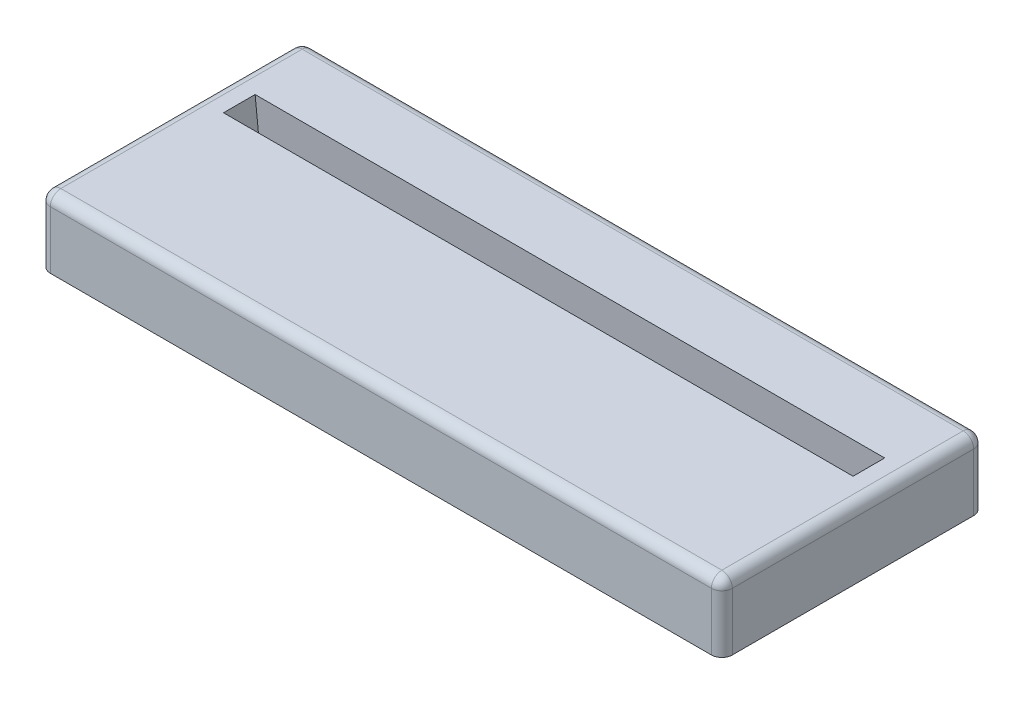
ISO-10303-21;
HEADER;
FILE_DESCRIPTION(('STEP AP214'),'2;1');
FILE_NAME('part.step','',(''),(''),'','','');
FILE_SCHEMA(('AUTOMOTIVE_DESIGN { 1 0 10303 214 1 1 1 1 }'));
ENDSEC;
DATA;
#1=APPLICATION_CONTEXT('core data for automotive mechanical design processes');
#2=APPLICATION_PROTOCOL_DEFINITION('international standard','automotive_design',2000,#1);
#3=PRODUCT_CONTEXT('',#1,'mechanical');
#4=PRODUCT('Part','Part','',(#3));
#5=PRODUCT_RELATED_PRODUCT_CATEGORY('part','',(#4));
#6=PRODUCT_DEFINITION_FORMATION('','',#4);
#7=PRODUCT_DEFINITION_CONTEXT('part definition',#1,'design');
#8=PRODUCT_DEFINITION('design','',#6,#7);
#9=PRODUCT_DEFINITION_SHAPE('','',#8);
#10=(LENGTH_UNIT() NAMED_UNIT(*) SI_UNIT(.MILLI.,.METRE.));
#11=(NAMED_UNIT(*) PLANE_ANGLE_UNIT() SI_UNIT($,.RADIAN.));
#12=(NAMED_UNIT(*) SI_UNIT($,.STERADIAN.) SOLID_ANGLE_UNIT());
#13=UNCERTAINTY_MEASURE_WITH_UNIT(LENGTH_MEASURE(1.E-05),#10,'distance_accuracy_value','');
#14=(GEOMETRIC_REPRESENTATION_CONTEXT(3) GLOBAL_UNCERTAINTY_ASSIGNED_CONTEXT((#13)) GLOBAL_UNIT_ASSIGNED_CONTEXT((#10,
#11,#12)) REPRESENTATION_CONTEXT('',''));
#15=CARTESIAN_POINT('',(0.,0.,0.));
#16=DIRECTION('',(0.,0.,1.));
#17=DIRECTION('',(1.,0.,0.));
#18=AXIS2_PLACEMENT_3D('',#15,#16,#17);
#19=CARTESIAN_POINT('',(120.,-6.5,0.));
#20=DIRECTION('',(0.,1.,0.));
#21=DIRECTION('',(0.,0.,1.));
#22=AXIS2_PLACEMENT_3D('',#19,#20,#21);
#23=PLANE('',#22);
#24=DIRECTION('',(-1.,0.,0.));
#25=VECTOR('',#24,1.);
#26=CARTESIAN_POINT('',(120.,-6.5,-10.5));
#27=LINE('',#26,#25);
#28=CARTESIAN_POINT('',(120.,-6.5,-10.5));
#29=VERTEX_POINT('',#28);
#30=CARTESIAN_POINT('',(0.,-6.5,-10.5));
#31=VERTEX_POINT('',#30);
#32=EDGE_CURVE('E348',#29,#31,#27,.T.);
#33=ORIENTED_EDGE('',*,*,#32,.T.);
#34=DIRECTION('',(0.,0.,-1.));
#35=VECTOR('',#34,1.);
#36=CARTESIAN_POINT('',(0.,-6.5,0.));
#37=LINE('',#36,#35);
#38=CARTESIAN_POINT('',(0.,-6.5,-7.50000000000001));
#39=VERTEX_POINT('',#38);
#40=EDGE_CURVE('E325',#39,#31,#37,.T.);
#41=ORIENTED_EDGE('',*,*,#40,.F.);
#42=DIRECTION('',(-1.,0.,0.));
#43=VECTOR('',#42,1.);
#44=CARTESIAN_POINT('',(120.,-6.5,-7.50000000000001));
#45=LINE('',#44,#43);
#46=CARTESIAN_POINT('',(120.,-6.5,-7.50000000000001));
#47=VERTEX_POINT('',#46);
#48=EDGE_CURVE('E314',#47,#39,#45,.T.);
#49=ORIENTED_EDGE('',*,*,#48,.F.);
#50=DIRECTION('',(0.,0.,-1.));
#51=VECTOR('',#50,1.);
#52=CARTESIAN_POINT('',(120.,-6.5,25.));
#53=LINE('',#52,#51);
#54=EDGE_CURVE('E290',#47,#29,#53,.T.);
#55=ORIENTED_EDGE('',*,*,#54,.T.);
#56=EDGE_LOOP('',(#33,#41,#49,#55));
#57=FACE_BOUND('',#56,.T.);
#58=DIRECTION('',(0.,0.,-1.));
#59=VECTOR('',#58,1.);
#60=CARTESIAN_POINT('',(-1.9,-6.5,21.9));
#61=LINE('',#60,#59);
#62=CARTESIAN_POINT('',(-1.9,-6.5,21.9));
#63=VERTEX_POINT('',#62);
#64=CARTESIAN_POINT('',(-1.9,-6.5,-21.9));
#65=VERTEX_POINT('',#64);
#66=EDGE_CURVE('E244',#63,#65,#61,.T.);
#67=ORIENTED_EDGE('',*,*,#66,.T.);
#68=DIRECTION('',(1.,0.,0.));
#69=VECTOR('',#68,1.);
#70=CARTESIAN_POINT('',(-1.9,-6.5,-21.9));
#71=LINE('',#70,#69);
#72=CARTESIAN_POINT('',(121.9,-6.5,-21.9));
#73=VERTEX_POINT('',#72);
#74=EDGE_CURVE('E215',#65,#73,#71,.T.);
#75=ORIENTED_EDGE('',*,*,#74,.T.);
#76=DIRECTION('',(0.,0.,1.));
#77=VECTOR('',#76,1.);
#78=CARTESIAN_POINT('',(121.9,-6.5,21.9));
#79=LINE('',#78,#77);
#80=CARTESIAN_POINT('',(121.9,-6.5,21.9));
#81=VERTEX_POINT('',#80);
#82=EDGE_CURVE('E239',#73,#81,#79,.T.);
#83=ORIENTED_EDGE('',*,*,#82,.T.);
#84=DIRECTION('',(-1.,0.,0.));
#85=VECTOR('',#84,1.);
#86=CARTESIAN_POINT('',(-1.9,-6.5,21.9));
#87=LINE('',#86,#85);
#88=EDGE_CURVE('E236',#81,#63,#87,.T.);
#89=ORIENTED_EDGE('',*,*,#88,.T.);
#90=EDGE_LOOP('',(#67,#75,#83,#89));
#91=FACE_BOUND('',#90,.T.);
#92=ADVANCED_FACE('F35',(#57,#91),#23,.F.);
#93=CARTESIAN_POINT('',(120.,6.5,0.));
#94=DIRECTION('',(0.,1.,0.));
#95=DIRECTION('',(0.,0.,1.));
#96=AXIS2_PLACEMENT_3D('',#93,#94,#95);
#97=PLANE('',#96);
#98=DIRECTION('',(-1.,0.,0.));
#99=VECTOR('',#98,1.);
#100=CARTESIAN_POINT('',(120.,6.5,-23.));
#101=LINE('',#100,#99);
#102=CARTESIAN_POINT('',(123.,6.5,-23.));
#103=VERTEX_POINT('',#102);
#104=CARTESIAN_POINT('',(-3.,6.5,-23.));
#105=VERTEX_POINT('',#104);
#106=EDGE_CURVE('E371',#103,#105,#101,.T.);
#107=ORIENTED_EDGE('',*,*,#106,.T.);
#108=DIRECTION('',(0.,0.,-1.));
#109=VECTOR('',#108,1.);
#110=CARTESIAN_POINT('',(-3.,6.5,25.));
#111=LINE('',#110,#109);
#112=CARTESIAN_POINT('',(-3.,6.5,23.));
#113=VERTEX_POINT('',#112);
#114=EDGE_CURVE('E373',#105,#113,#111,.F.);
#115=ORIENTED_EDGE('',*,*,#114,.T.);
#116=DIRECTION('',(1.,0.,0.));
#117=VECTOR('',#116,1.);
#118=CARTESIAN_POINT('',(120.,6.5,23.));
#119=LINE('',#118,#117);
#120=CARTESIAN_POINT('',(123.,6.5,23.));
#121=VERTEX_POINT('',#120);
#122=EDGE_CURVE('E367',#113,#121,#119,.T.);
#123=ORIENTED_EDGE('',*,*,#122,.T.);
#124=DIRECTION('',(0.,0.,1.));
#125=VECTOR('',#124,1.);
#126=CARTESIAN_POINT('',(123.,6.5,-25.));
#127=LINE('',#126,#125);
#128=EDGE_CURVE('E369',#121,#103,#127,.F.);
#129=ORIENTED_EDGE('',*,*,#128,.T.);
#130=EDGE_LOOP('',(#107,#115,#123,#129));
#131=FACE_BOUND('',#130,.T.);
#132=DIRECTION('',(-1.,0.,0.));
#133=VECTOR('',#132,1.);
#134=CARTESIAN_POINT('',(120.,6.5,-11.0356647853344));
#135=LINE('',#134,#133);
#136=CARTESIAN_POINT('',(120.,6.5,-11.0356647853344));
#137=VERTEX_POINT('',#136);
#138=CARTESIAN_POINT('',(0.,6.5,-11.0356647853344));
#139=VERTEX_POINT('',#138);
#140=EDGE_CURVE('E357',#137,#139,#135,.T.);
#141=ORIENTED_EDGE('',*,*,#140,.F.);
#142=DIRECTION('',(0.,0.,1.));
#143=VECTOR('',#142,1.);
#144=CARTESIAN_POINT('',(120.,6.5,25.));
#145=LINE('',#144,#143);
#146=CARTESIAN_POINT('',(120.,6.5,-5.00860993816238));
#147=VERTEX_POINT('',#146);
#148=EDGE_CURVE('E279',#137,#147,#145,.T.);
#149=ORIENTED_EDGE('',*,*,#148,.T.);
#150=DIRECTION('',(-1.,0.,0.));
#151=VECTOR('',#150,1.);
#152=CARTESIAN_POINT('',(120.,6.5,-5.00860993816238));
#153=LINE('',#152,#151);
#154=CARTESIAN_POINT('',(0.,6.5,-5.00860993816238));
#155=VERTEX_POINT('',#154);
#156=EDGE_CURVE('E316',#147,#155,#153,.T.);
#157=ORIENTED_EDGE('',*,*,#156,.T.);
#158=DIRECTION('',(0.,0.,-1.));
#159=VECTOR('',#158,1.);
#160=CARTESIAN_POINT('',(0.,6.5,0.));
#161=LINE('',#160,#159);
#162=EDGE_CURVE('E320',#155,#139,#161,.T.);
#163=ORIENTED_EDGE('',*,*,#162,.T.);
#164=EDGE_LOOP('',(#141,#149,#157,#163));
#165=FACE_BOUND('',#164,.T.);
#166=ADVANCED_FACE('F476',(#131,#165),#97,.T.);
#167=CARTESIAN_POINT('',(120.,1.09800518428661,-11.5492412352769));
#168=DIRECTION('',(0.,0.0946448625000819,-0.995511099889067));
#169=DIRECTION('',(0.,0.995511099889067,0.0946448625000819));
#170=AXIS2_PLACEMENT_3D('',#167,#168,#169);
#171=PLANE('',#170);
#172=DIRECTION('',(0.,-0.995511099889067,-0.0946448625000819));
#173=VECTOR('',#172,1.);
#174=CARTESIAN_POINT('',(0.,1.09800518428661,-11.5492412352769));
#175=LINE('',#174,#173);
#176=CARTESIAN_POINT('',(0.,-3.35995315796779,-11.9730665993344));
#177=VERTEX_POINT('',#176);
#178=EDGE_CURVE('E329',#139,#177,#175,.T.);
#179=ORIENTED_EDGE('',*,*,#178,.T.);
#180=DIRECTION('',(-1.,0.,0.));
#181=VECTOR('',#180,1.);
#182=CARTESIAN_POINT('',(120.,-3.35995315796779,-11.9730665993344));
#183=LINE('',#182,#181);
#184=CARTESIAN_POINT('',(120.,-3.35995315796779,-11.9730665993344));
#185=VERTEX_POINT('',#184);
#186=EDGE_CURVE('E354',#185,#177,#183,.T.);
#187=ORIENTED_EDGE('',*,*,#186,.F.);
#188=DIRECTION('',(0.,-0.995511099889067,-0.0946448625000819));
#189=VECTOR('',#188,1.);
#190=CARTESIAN_POINT('',(120.,1.09800518428661,-11.5492412352769));
#191=LINE('',#190,#189);
#192=EDGE_CURVE('E330',#137,#185,#191,.T.);
#193=ORIENTED_EDGE('',*,*,#192,.F.);
#194=ORIENTED_EDGE('',*,*,#140,.T.);
#195=EDGE_LOOP('',(#179,#187,#193,#194));
#196=FACE_BOUND('',#195,.T.);
#197=ADVANCED_FACE('F510',(#196),#171,.F.);
#198=CARTESIAN_POINT('',(120.,-4.4579583422544,-0.423825364057494));
#199=DIRECTION('',(0.,0.995511099889067,0.0946448625000818));
#200=DIRECTION('',(0.,-0.0946448625000818,0.995511099889067));
#201=AXIS2_PLACEMENT_3D('',#198,#199,#200);
#202=PLANE('',#201);
#203=DIRECTION('',(0.,0.0946448625000818,-0.995511099889067));
#204=VECTOR('',#203,1.);
#205=CARTESIAN_POINT('',(0.,-4.4579583422544,-0.423825364057494));
#206=LINE('',#205,#204);
#207=CARTESIAN_POINT('',(0.,-3.5,-10.5));
#208=VERTEX_POINT('',#207);
#209=EDGE_CURVE('E343',#208,#177,#206,.T.);
#210=ORIENTED_EDGE('',*,*,#209,.F.);
#211=DIRECTION('',(-1.,0.,0.));
#212=VECTOR('',#211,1.);
#213=CARTESIAN_POINT('',(120.,-3.5,-10.5));
#214=LINE('',#213,#212);
#215=CARTESIAN_POINT('',(120.,-3.5,-10.5));
#216=VERTEX_POINT('',#215);
#217=EDGE_CURVE('E351',#216,#208,#214,.T.);
#218=ORIENTED_EDGE('',*,*,#217,.F.);
#219=DIRECTION('',(0.,0.0946448625000818,-0.995511099889067));
#220=VECTOR('',#219,1.);
#221=CARTESIAN_POINT('',(120.,-4.4579583422544,-0.423825364057494));
#222=LINE('',#221,#220);
#223=EDGE_CURVE('E333',#216,#185,#222,.T.);
#224=ORIENTED_EDGE('',*,*,#223,.T.);
#225=ORIENTED_EDGE('',*,*,#186,.T.);
#226=EDGE_LOOP('',(#210,#218,#224,#225));
#227=FACE_BOUND('',#226,.T.);
#228=ADVANCED_FACE('F516',(#227),#202,.T.);
#229=CARTESIAN_POINT('',(120.,0.,-10.5));
#230=DIRECTION('',(0.,0.,1.));
#231=DIRECTION('',(1.,0.,0.));
#232=AXIS2_PLACEMENT_3D('',#229,#230,#231);
#233=PLANE('',#232);
#234=DIRECTION('',(0.,1.,0.));
#235=VECTOR('',#234,1.);
#236=CARTESIAN_POINT('',(0.,0.,-10.5));
#237=LINE('',#236,#235);
#238=EDGE_CURVE('E334',#31,#208,#237,.T.);
#239=ORIENTED_EDGE('',*,*,#238,.F.);
#240=ORIENTED_EDGE('',*,*,#32,.F.);
#241=DIRECTION('',(0.,1.,0.));
#242=VECTOR('',#241,1.);
#243=CARTESIAN_POINT('',(120.,0.,-10.5));
#244=LINE('',#243,#242);
#245=EDGE_CURVE('E337',#29,#216,#244,.T.);
#246=ORIENTED_EDGE('',*,*,#245,.T.);
#247=ORIENTED_EDGE('',*,*,#217,.T.);
#248=EDGE_LOOP('',(#239,#240,#246,#247));
#249=FACE_BOUND('',#248,.T.);
#250=ADVANCED_FACE('F501',(#249),#233,.T.);
#251=DIRECTION('',(1.,0.,0.));
#252=VECTOR('',#251,1.);
#253=CARTESIAN_POINT('',(-3.09999999999999,-6.5,-23.1));
#254=LINE('',#253,#252);
#255=CARTESIAN_POINT('',(-3.09999999999999,-6.5,-23.1));
#256=VERTEX_POINT('',#255);
#257=CARTESIAN_POINT('',(123.1,-6.5,-23.1));
#258=VERTEX_POINT('',#257);
#259=EDGE_CURVE('E269',#256,#258,#254,.T.);
#260=ORIENTED_EDGE('',*,*,#259,.F.);
#261=DIRECTION('',(0.,0.,-1.));
#262=VECTOR('',#261,1.);
#263=CARTESIAN_POINT('',(-3.1,-6.5,23.1));
#264=LINE('',#263,#262);
#265=CARTESIAN_POINT('',(-3.1,-6.5,23.1));
#266=VERTEX_POINT('',#265);
#267=EDGE_CURVE('E250',#266,#256,#264,.T.);
#268=ORIENTED_EDGE('',*,*,#267,.F.);
#269=DIRECTION('',(-1.,0.,0.));
#270=VECTOR('',#269,1.);
#271=CARTESIAN_POINT('',(-3.1,-6.5,23.1));
#272=LINE('',#271,#270);
#273=CARTESIAN_POINT('',(123.1,-6.5,23.1));
#274=VERTEX_POINT('',#273);
#275=EDGE_CURVE('E258',#274,#266,#272,.T.);
#276=ORIENTED_EDGE('',*,*,#275,.F.);
#277=DIRECTION('',(0.,0.,1.));
#278=VECTOR('',#277,1.);
#279=CARTESIAN_POINT('',(123.1,-6.5,23.1));
#280=LINE('',#279,#278);
#281=EDGE_CURVE('E272',#258,#274,#280,.T.);
#282=ORIENTED_EDGE('',*,*,#281,.F.);
#283=EDGE_LOOP('',(#260,#268,#276,#282));
#284=FACE_BOUND('',#283,.T.);
#285=DIRECTION('',(0.,0.,-1.));
#286=VECTOR('',#285,1.);
#287=CARTESIAN_POINT('',(125.,-6.5,25.));
#288=LINE('',#287,#286);
#289=CARTESIAN_POINT('',(125.,-6.5,23.));
#290=VERTEX_POINT('',#289);
#291=CARTESIAN_POINT('',(125.,-6.5,-23.));
#292=VERTEX_POINT('',#291);
#293=EDGE_CURVE('E286',#290,#292,#288,.T.);
#294=ORIENTED_EDGE('',*,*,#293,.F.);
#295=CARTESIAN_POINT('',(123.,-6.5,23.));
#296=DIRECTION('',(0.,1.,0.));
#297=DIRECTION('',(0.,0.,1.));
#298=AXIS2_PLACEMENT_3D('',#295,#296,#297);
#299=CIRCLE('',#298,2.);
#300=CARTESIAN_POINT('',(123.,-6.5,25.));
#301=VERTEX_POINT('',#300);
#302=EDGE_CURVE('E11',#290,#301,#299,.F.);
#303=ORIENTED_EDGE('',*,*,#302,.T.);
#304=DIRECTION('',(1.,0.,0.));
#305=VECTOR('',#304,1.);
#306=CARTESIAN_POINT('',(-5.,-6.5,25.));
#307=LINE('',#306,#305);
#308=CARTESIAN_POINT('',(-3.,-6.5,25.));
#309=VERTEX_POINT('',#308);
#310=EDGE_CURVE('E324',#309,#301,#307,.T.);
#311=ORIENTED_EDGE('',*,*,#310,.F.);
#312=CARTESIAN_POINT('',(-3.,-6.5,23.));
#313=DIRECTION('',(0.,1.,0.));
#314=DIRECTION('',(0.,0.,1.));
#315=AXIS2_PLACEMENT_3D('',#312,#313,#314);
#316=CIRCLE('',#315,2.);
#317=CARTESIAN_POINT('',(-5.,-6.5,23.));
#318=VERTEX_POINT('',#317);
#319=EDGE_CURVE('E44',#309,#318,#316,.F.);
#320=ORIENTED_EDGE('',*,*,#319,.T.);
#321=DIRECTION('',(0.,0.,-1.));
#322=VECTOR('',#321,1.);
#323=CARTESIAN_POINT('',(-5.,-6.5,0.));
#324=LINE('',#323,#322);
#325=CARTESIAN_POINT('',(-5.,-6.5,-23.));
#326=VERTEX_POINT('',#325);
#327=EDGE_CURVE('E321',#318,#326,#324,.T.);
#328=ORIENTED_EDGE('',*,*,#327,.T.);
#329=CARTESIAN_POINT('',(-3.,-6.5,-23.));
#330=DIRECTION('',(0.,1.,0.));
#331=DIRECTION('',(0.,0.,1.));
#332=AXIS2_PLACEMENT_3D('',#329,#330,#331);
#333=CIRCLE('',#332,2.);
#334=CARTESIAN_POINT('',(-2.99999999999998,-6.5,-25.));
#335=VERTEX_POINT('',#334);
#336=EDGE_CURVE('E394',#326,#335,#333,.F.);
#337=ORIENTED_EDGE('',*,*,#336,.T.);
#338=DIRECTION('',(-1.,0.,0.));
#339=VECTOR('',#338,1.);
#340=CARTESIAN_POINT('',(120.,-6.5,-25.));
#341=LINE('',#340,#339);
#342=CARTESIAN_POINT('',(123.,-6.5,-25.));
#343=VERTEX_POINT('',#342);
#344=EDGE_CURVE('E340',#343,#335,#341,.T.);
#345=ORIENTED_EDGE('',*,*,#344,.F.);
#346=CARTESIAN_POINT('',(123.,-6.5,-23.));
#347=DIRECTION('',(0.,1.,0.));
#348=DIRECTION('',(0.,0.,1.));
#349=AXIS2_PLACEMENT_3D('',#346,#347,#348);
#350=CIRCLE('',#349,2.);
#351=EDGE_CURVE('E392',#343,#292,#350,.F.);
#352=ORIENTED_EDGE('',*,*,#351,.T.);
#353=EDGE_LOOP('',(#294,#303,#311,#320,#328,#337,#345,#352));
#354=FACE_BOUND('',#353,.T.);
#355=ADVANCED_FACE('F451',(#284,#354),#23,.F.);
#356=CARTESIAN_POINT('',(120.,0.,-25.));
#357=DIRECTION('',(0.,0.,-1.));
#358=DIRECTION('',(0.,1.,0.));
#359=AXIS2_PLACEMENT_3D('',#356,#357,#358);
#360=PLANE('',#359);
#361=ORIENTED_EDGE('',*,*,#344,.T.);
#362=DIRECTION('',(0.,-1.,0.));
#363=VECTOR('',#362,1.);
#364=CARTESIAN_POINT('',(-3.,6.5,-25.));
#365=LINE('',#364,#363);
#366=CARTESIAN_POINT('',(-3.,4.5,-25.));
#367=VERTEX_POINT('',#366);
#368=EDGE_CURVE('E380',#335,#367,#365,.F.);
#369=ORIENTED_EDGE('',*,*,#368,.T.);
#370=DIRECTION('',(-1.,0.,0.));
#371=VECTOR('',#370,1.);
#372=CARTESIAN_POINT('',(120.,4.5,-25.));
#373=LINE('',#372,#371);
#374=CARTESIAN_POINT('',(123.,4.5,-25.));
#375=VERTEX_POINT('',#374);
#376=EDGE_CURVE('E378',#367,#375,#373,.F.);
#377=ORIENTED_EDGE('',*,*,#376,.T.);
#378=DIRECTION('',(0.,1.,0.));
#379=VECTOR('',#378,1.);
#380=CARTESIAN_POINT('',(123.,-6.5,-25.));
#381=LINE('',#380,#379);
#382=EDGE_CURVE('E376',#375,#343,#381,.F.);
#383=ORIENTED_EDGE('',*,*,#382,.T.);
#384=EDGE_LOOP('',(#361,#369,#377,#383));
#385=FACE_BOUND('',#384,.T.);
#386=ADVANCED_FACE('F493',(#385),#360,.T.);
#387=CARTESIAN_POINT('',(-5.,0.,25.));
#388=DIRECTION('',(0.,0.,1.));
#389=DIRECTION('',(1.,0.,0.));
#390=AXIS2_PLACEMENT_3D('',#387,#388,#389);
#391=PLANE('',#390);
#392=ORIENTED_EDGE('',*,*,#310,.T.);
#393=DIRECTION('',(0.,-1.,0.));
#394=VECTOR('',#393,1.);
#395=CARTESIAN_POINT('',(123.,6.5,25.));
#396=LINE('',#395,#394);
#397=CARTESIAN_POINT('',(123.,4.5,25.));
#398=VERTEX_POINT('',#397);
#399=EDGE_CURVE('E52',#301,#398,#396,.F.);
#400=ORIENTED_EDGE('',*,*,#399,.T.);
#401=DIRECTION('',(1.,0.,0.));
#402=VECTOR('',#401,1.);
#403=CARTESIAN_POINT('',(-5.,4.5,25.));
#404=LINE('',#403,#402);
#405=CARTESIAN_POINT('',(-3.,4.5,25.));
#406=VERTEX_POINT('',#405);
#407=EDGE_CURVE('E57',#398,#406,#404,.F.);
#408=ORIENTED_EDGE('',*,*,#407,.T.);
#409=DIRECTION('',(0.,-1.,0.));
#410=VECTOR('',#409,1.);
#411=CARTESIAN_POINT('',(-3.,-6.5,25.));
#412=LINE('',#411,#410);
#413=EDGE_CURVE('E388',#406,#309,#412,.T.);
#414=ORIENTED_EDGE('',*,*,#413,.T.);
#415=EDGE_LOOP('',(#392,#400,#408,#414));
#416=FACE_BOUND('',#415,.T.);
#417=ADVANCED_FACE('F448',(#416),#391,.T.);
#418=CARTESIAN_POINT('',(-5.,0.,0.));
#419=DIRECTION('',(1.,0.,0.));
#420=DIRECTION('',(0.,0.,-1.));
#421=AXIS2_PLACEMENT_3D('',#418,#419,#420);
#422=PLANE('',#421);
#423=ORIENTED_EDGE('',*,*,#327,.F.);
#424=DIRECTION('',(0.,-1.,0.));
#425=VECTOR('',#424,1.);
#426=CARTESIAN_POINT('',(-5.,6.5,23.));
#427=LINE('',#426,#425);
#428=CARTESIAN_POINT('',(-5.,4.5,23.));
#429=VERTEX_POINT('',#428);
#430=EDGE_CURVE('E365',#318,#429,#427,.F.);
#431=ORIENTED_EDGE('',*,*,#430,.T.);
#432=DIRECTION('',(0.,0.,-1.));
#433=VECTOR('',#432,1.);
#434=CARTESIAN_POINT('',(-5.,4.5,-25.));
#435=LINE('',#434,#433);
#436=CARTESIAN_POINT('',(-5.,4.5,-23.));
#437=VERTEX_POINT('',#436);
#438=EDGE_CURVE('E362',#429,#437,#435,.T.);
#439=ORIENTED_EDGE('',*,*,#438,.T.);
#440=DIRECTION('',(0.,-1.,0.));
#441=VECTOR('',#440,1.);
#442=CARTESIAN_POINT('',(-5.,-6.5,-23.));
#443=LINE('',#442,#441);
#444=EDGE_CURVE('E360',#437,#326,#443,.T.);
#445=ORIENTED_EDGE('',*,*,#444,.T.);
#446=EDGE_LOOP('',(#423,#431,#439,#445));
#447=FACE_BOUND('',#446,.T.);
#448=ADVANCED_FACE('F490',(#447),#422,.F.);
#449=CARTESIAN_POINT('',(0.,0.,0.));
#450=DIRECTION('',(1.,0.,0.));
#451=DIRECTION('',(0.,0.,-1.));
#452=AXIS2_PLACEMENT_3D('',#449,#450,#451);
#453=PLANE('',#452);
#454=DIRECTION('',(0.,-0.995511099889067,-0.0946448625000818));
#455=VECTOR('',#454,1.);
#456=CARTESIAN_POINT('',(0.,0.530136009286116,-5.57617463594251));
#457=LINE('',#456,#455);
#458=CARTESIAN_POINT('',(0.,-3.92782233296829,-6.00000000000001));
#459=VERTEX_POINT('',#458);
#460=EDGE_CURVE('E308',#155,#459,#457,.T.);
#461=ORIENTED_EDGE('',*,*,#460,.T.);
#462=DIRECTION('',(0.,0.0946448625000818,-0.995511099889067));
#463=VECTOR('',#462,1.);
#464=CARTESIAN_POINT('',(0.,-4.4579583422544,-0.423825364057494));
#465=LINE('',#464,#463);
#466=CARTESIAN_POINT('',(0.,-3.78521488864552,-7.50000000000001));
#467=VERTEX_POINT('',#466);
#468=EDGE_CURVE('E289',#459,#467,#465,.T.);
#469=ORIENTED_EDGE('',*,*,#468,.T.);
#470=DIRECTION('',(0.,1.,0.));
#471=VECTOR('',#470,1.);
#472=CARTESIAN_POINT('',(0.,0.,-7.50000000000001));
#473=LINE('',#472,#471);
#474=EDGE_CURVE('E299',#39,#467,#473,.T.);
#475=ORIENTED_EDGE('',*,*,#474,.F.);
#476=ORIENTED_EDGE('',*,*,#40,.T.);
#477=ORIENTED_EDGE('',*,*,#238,.T.);
#478=ORIENTED_EDGE('',*,*,#209,.T.);
#479=ORIENTED_EDGE('',*,*,#178,.F.);
#480=ORIENTED_EDGE('',*,*,#162,.F.);
#481=EDGE_LOOP('',(#461,#469,#475,#476,#477,#478,#479,#480));
#482=FACE_BOUND('',#481,.T.);
#483=ADVANCED_FACE('F597',(#482),#453,.T.);
#484=CARTESIAN_POINT('',(120.,-4.4579583422544,-0.423825364057494));
#485=DIRECTION('',(0.,0.995511099889067,0.0946448625000818));
#486=DIRECTION('',(0.,-0.0946448625000818,0.995511099889067));
#487=AXIS2_PLACEMENT_3D('',#484,#485,#486);
#488=PLANE('',#487);
#489=ORIENTED_EDGE('',*,*,#468,.F.);
#490=DIRECTION('',(-1.,0.,0.));
#491=VECTOR('',#490,1.);
#492=CARTESIAN_POINT('',(120.,-3.92782233296829,-6.00000000000001));
#493=LINE('',#492,#491);
#494=CARTESIAN_POINT('',(120.,-3.92782233296829,-6.00000000000001));
#495=VERTEX_POINT('',#494);
#496=EDGE_CURVE('E318',#495,#459,#493,.T.);
#497=ORIENTED_EDGE('',*,*,#496,.F.);
#498=DIRECTION('',(0.,0.0946448625000818,-0.995511099889067));
#499=VECTOR('',#498,1.);
#500=CARTESIAN_POINT('',(120.,-4.4579583422544,-0.423825364057494));
#501=LINE('',#500,#499);
#502=CARTESIAN_POINT('',(120.,-3.78521488864552,-7.50000000000001));
#503=VERTEX_POINT('',#502);
#504=EDGE_CURVE('E295',#495,#503,#501,.T.);
#505=ORIENTED_EDGE('',*,*,#504,.T.);
#506=DIRECTION('',(-1.,0.,0.));
#507=VECTOR('',#506,1.);
#508=CARTESIAN_POINT('',(120.,-3.78521488864552,-7.50000000000001));
#509=LINE('',#508,#507);
#510=EDGE_CURVE('E305',#503,#467,#509,.T.);
#511=ORIENTED_EDGE('',*,*,#510,.T.);
#512=EDGE_LOOP('',(#489,#497,#505,#511));
#513=FACE_BOUND('',#512,.T.);
#514=ADVANCED_FACE('F593',(#513),#488,.T.);
#515=CARTESIAN_POINT('',(120.,0.530136009286116,-5.57617463594251));
#516=DIRECTION('',(0.,0.0946448625000818,-0.995511099889067));
#517=DIRECTION('',(0.,0.995511099889067,0.0946448625000818));
#518=AXIS2_PLACEMENT_3D('',#515,#516,#517);
#519=PLANE('',#518);
#520=ORIENTED_EDGE('',*,*,#460,.F.);
#521=ORIENTED_EDGE('',*,*,#156,.F.);
#522=DIRECTION('',(0.,-0.995511099889067,-0.0946448625000818));
#523=VECTOR('',#522,1.);
#524=CARTESIAN_POINT('',(120.,0.530136009286116,-5.57617463594251));
#525=LINE('',#524,#523);
#526=EDGE_CURVE('E298',#147,#495,#525,.T.);
#527=ORIENTED_EDGE('',*,*,#526,.T.);
#528=ORIENTED_EDGE('',*,*,#496,.T.);
#529=EDGE_LOOP('',(#520,#521,#527,#528));
#530=FACE_BOUND('',#529,.T.);
#531=ADVANCED_FACE('F589',(#530),#519,.T.);
#532=CARTESIAN_POINT('',(120.,0.,-7.50000000000001));
#533=DIRECTION('',(0.,0.,1.));
#534=DIRECTION('',(0.,-1.,0.));
#535=AXIS2_PLACEMENT_3D('',#532,#533,#534);
#536=PLANE('',#535);
#537=ORIENTED_EDGE('',*,*,#474,.T.);
#538=ORIENTED_EDGE('',*,*,#510,.F.);
#539=DIRECTION('',(0.,1.,0.));
#540=VECTOR('',#539,1.);
#541=CARTESIAN_POINT('',(120.,0.,-7.50000000000001));
#542=LINE('',#541,#540);
#543=EDGE_CURVE('E302',#47,#503,#542,.T.);
#544=ORIENTED_EDGE('',*,*,#543,.F.);
#545=ORIENTED_EDGE('',*,*,#48,.T.);
#546=EDGE_LOOP('',(#537,#538,#544,#545));
#547=FACE_BOUND('',#546,.T.);
#548=ADVANCED_FACE('F585',(#547),#536,.F.);
#549=CARTESIAN_POINT('',(120.,0.,0.));
#550=DIRECTION('',(-1.,0.,0.));
#551=DIRECTION('',(0.,0.,1.));
#552=AXIS2_PLACEMENT_3D('',#549,#550,#551);
#553=PLANE('',#552);
#554=ORIENTED_EDGE('',*,*,#192,.T.);
#555=ORIENTED_EDGE('',*,*,#223,.F.);
#556=ORIENTED_EDGE('',*,*,#245,.F.);
#557=ORIENTED_EDGE('',*,*,#54,.F.);
#558=ORIENTED_EDGE('',*,*,#543,.T.);
#559=ORIENTED_EDGE('',*,*,#504,.F.);
#560=ORIENTED_EDGE('',*,*,#526,.F.);
#561=ORIENTED_EDGE('',*,*,#148,.F.);
#562=EDGE_LOOP('',(#554,#555,#556,#557,#558,#559,#560,#561));
#563=FACE_BOUND('',#562,.T.);
#564=ADVANCED_FACE('F582',(#563),#553,.T.);
#565=CARTESIAN_POINT('',(125.,0.,0.));
#566=DIRECTION('',(-1.,0.,0.));
#567=DIRECTION('',(0.,0.,1.));
#568=AXIS2_PLACEMENT_3D('',#565,#566,#567);
#569=PLANE('',#568);
#570=DIRECTION('',(0.,0.,1.));
#571=VECTOR('',#570,1.);
#572=CARTESIAN_POINT('',(125.,4.5,25.));
#573=LINE('',#572,#571);
#574=CARTESIAN_POINT('',(125.,4.5,-23.));
#575=VERTEX_POINT('',#574);
#576=CARTESIAN_POINT('',(125.,4.5,23.));
#577=VERTEX_POINT('',#576);
#578=EDGE_CURVE('E384',#575,#577,#573,.T.);
#579=ORIENTED_EDGE('',*,*,#578,.T.);
#580=DIRECTION('',(0.,-1.,0.));
#581=VECTOR('',#580,1.);
#582=CARTESIAN_POINT('',(125.,-6.5,23.));
#583=LINE('',#582,#581);
#584=EDGE_CURVE('E386',#577,#290,#583,.T.);
#585=ORIENTED_EDGE('',*,*,#584,.T.);
#586=ORIENTED_EDGE('',*,*,#293,.T.);
#587=DIRECTION('',(0.,1.,0.));
#588=VECTOR('',#587,1.);
#589=CARTESIAN_POINT('',(125.,6.5,-23.));
#590=LINE('',#589,#588);
#591=EDGE_CURVE('E382',#292,#575,#590,.T.);
#592=ORIENTED_EDGE('',*,*,#591,.T.);
#593=EDGE_LOOP('',(#579,#585,#586,#592));
#594=FACE_BOUND('',#593,.T.);
#595=ADVANCED_FACE('F457',(#594),#569,.F.);
#596=CARTESIAN_POINT('',(-3.1,0.500000000000002,23.1));
#597=DIRECTION('',(-1.,0.,0.));
#598=DIRECTION('',(0.,0.,1.));
#599=AXIS2_PLACEMENT_3D('',#596,#597,#598);
#600=PLANE('',#599);
#601=ORIENTED_EDGE('',*,*,#267,.T.);
#602=DIRECTION('',(0.,-1.,0.));
#603=VECTOR('',#602,1.);
#604=CARTESIAN_POINT('',(-3.09999999999999,0.500000000000002,-23.1));
#605=LINE('',#604,#603);
#606=CARTESIAN_POINT('',(-3.09999999999999,0.500000000000002,-23.1));
#607=VERTEX_POINT('',#606);
#608=EDGE_CURVE('E267',#607,#256,#605,.T.);
#609=ORIENTED_EDGE('',*,*,#608,.F.);
#610=DIRECTION('',(0.,0.,-1.));
#611=VECTOR('',#610,1.);
#612=CARTESIAN_POINT('',(-3.1,0.500000000000002,23.1));
#613=LINE('',#612,#611);
#614=CARTESIAN_POINT('',(-3.1,0.500000000000002,23.1));
#615=VERTEX_POINT('',#614);
#616=EDGE_CURVE('E254',#615,#607,#613,.T.);
#617=ORIENTED_EDGE('',*,*,#616,.F.);
#618=DIRECTION('',(0.,-1.,0.));
#619=VECTOR('',#618,1.);
#620=CARTESIAN_POINT('',(-3.1,0.500000000000002,23.1));
#621=LINE('',#620,#619);
#622=EDGE_CURVE('E277',#615,#266,#621,.T.);
#623=ORIENTED_EDGE('',*,*,#622,.T.);
#624=EDGE_LOOP('',(#601,#609,#617,#623));
#625=FACE_BOUND('',#624,.T.);
#626=ADVANCED_FACE('F569',(#625),#600,.F.);
#627=CARTESIAN_POINT('',(-3.1,0.500000000000002,23.1));
#628=DIRECTION('',(0.,0.,1.));
#629=DIRECTION('',(1.,0.,0.));
#630=AXIS2_PLACEMENT_3D('',#627,#628,#629);
#631=PLANE('',#630);
#632=ORIENTED_EDGE('',*,*,#275,.T.);
#633=ORIENTED_EDGE('',*,*,#622,.F.);
#634=DIRECTION('',(-1.,0.,0.));
#635=VECTOR('',#634,1.);
#636=CARTESIAN_POINT('',(-3.1,0.500000000000002,23.1));
#637=LINE('',#636,#635);
#638=CARTESIAN_POINT('',(123.1,0.500000000000002,23.1));
#639=VERTEX_POINT('',#638);
#640=EDGE_CURVE('E264',#639,#615,#637,.T.);
#641=ORIENTED_EDGE('',*,*,#640,.F.);
#642=DIRECTION('',(0.,-1.,0.));
#643=VECTOR('',#642,1.);
#644=CARTESIAN_POINT('',(123.1,0.500000000000002,23.1));
#645=LINE('',#644,#643);
#646=EDGE_CURVE('E280',#639,#274,#645,.T.);
#647=ORIENTED_EDGE('',*,*,#646,.T.);
#648=EDGE_LOOP('',(#632,#633,#641,#647));
#649=FACE_BOUND('',#648,.T.);
#650=ADVANCED_FACE('F565',(#649),#631,.F.);
#651=CARTESIAN_POINT('',(123.1,0.500000000000002,23.1));
#652=DIRECTION('',(1.,0.,0.));
#653=DIRECTION('',(0.,0.,-1.));
#654=AXIS2_PLACEMENT_3D('',#651,#652,#653);
#655=PLANE('',#654);
#656=ORIENTED_EDGE('',*,*,#281,.T.);
#657=ORIENTED_EDGE('',*,*,#646,.F.);
#658=DIRECTION('',(0.,0.,1.));
#659=VECTOR('',#658,1.);
#660=CARTESIAN_POINT('',(123.1,0.500000000000002,23.1));
#661=LINE('',#660,#659);
#662=CARTESIAN_POINT('',(123.1,0.500000000000002,-23.1));
#663=VERTEX_POINT('',#662);
#664=EDGE_CURVE('E261',#663,#639,#661,.T.);
#665=ORIENTED_EDGE('',*,*,#664,.F.);
#666=DIRECTION('',(0.,-1.,0.));
#667=VECTOR('',#666,1.);
#668=CARTESIAN_POINT('',(123.1,0.500000000000002,-23.1));
#669=LINE('',#668,#667);
#670=EDGE_CURVE('E282',#663,#258,#669,.T.);
#671=ORIENTED_EDGE('',*,*,#670,.T.);
#672=EDGE_LOOP('',(#656,#657,#665,#671));
#673=FACE_BOUND('',#672,.T.);
#674=ADVANCED_FACE('F568',(#673),#655,.F.);
#675=CARTESIAN_POINT('',(-3.09999999999999,0.500000000000002,-23.1));
#676=DIRECTION('',(0.,0.,-1.));
#677=DIRECTION('',(-1.,0.,0.));
#678=AXIS2_PLACEMENT_3D('',#675,#676,#677);
#679=PLANE('',#678);
#680=ORIENTED_EDGE('',*,*,#259,.T.);
#681=ORIENTED_EDGE('',*,*,#670,.F.);
#682=DIRECTION('',(1.,0.,0.));
#683=VECTOR('',#682,1.);
#684=CARTESIAN_POINT('',(-3.09999999999999,0.500000000000002,-23.1));
#685=LINE('',#684,#683);
#686=EDGE_CURVE('E257',#607,#663,#685,.T.);
#687=ORIENTED_EDGE('',*,*,#686,.F.);
#688=ORIENTED_EDGE('',*,*,#608,.T.);
#689=EDGE_LOOP('',(#680,#681,#687,#688));
#690=FACE_BOUND('',#689,.T.);
#691=ADVANCED_FACE('F564',(#690),#679,.F.);
#692=CARTESIAN_POINT('',(0.,0.500000000000002,0.));
#693=DIRECTION('',(0.,-1.,0.));
#694=DIRECTION('',(0.,0.,-1.));
#695=AXIS2_PLACEMENT_3D('',#692,#693,#694);
#696=PLANE('',#695);
#697=DIRECTION('',(-1.,0.,0.));
#698=VECTOR('',#697,1.);
#699=CARTESIAN_POINT('',(-1.9,0.500000000000002,21.9));
#700=LINE('',#699,#698);
#701=CARTESIAN_POINT('',(121.9,0.500000000000002,21.9));
#702=VERTEX_POINT('',#701);
#703=CARTESIAN_POINT('',(-1.9,0.500000000000002,21.9));
#704=VERTEX_POINT('',#703);
#705=EDGE_CURVE('E221',#702,#704,#700,.T.);
#706=ORIENTED_EDGE('',*,*,#705,.F.);
#707=DIRECTION('',(0.,0.,1.));
#708=VECTOR('',#707,1.);
#709=CARTESIAN_POINT('',(121.9,0.500000000000002,21.9));
#710=LINE('',#709,#708);
#711=CARTESIAN_POINT('',(121.9,0.500000000000002,-21.9));
#712=VERTEX_POINT('',#711);
#713=EDGE_CURVE('E231',#712,#702,#710,.T.);
#714=ORIENTED_EDGE('',*,*,#713,.F.);
#715=DIRECTION('',(1.,0.,0.));
#716=VECTOR('',#715,1.);
#717=CARTESIAN_POINT('',(-1.9,0.500000000000002,-21.9));
#718=LINE('',#717,#716);
#719=CARTESIAN_POINT('',(-1.9,0.500000000000002,-21.9));
#720=VERTEX_POINT('',#719);
#721=EDGE_CURVE('E213',#720,#712,#718,.T.);
#722=ORIENTED_EDGE('',*,*,#721,.F.);
#723=DIRECTION('',(0.,0.,-1.));
#724=VECTOR('',#723,1.);
#725=CARTESIAN_POINT('',(-1.9,0.500000000000002,21.9));
#726=LINE('',#725,#724);
#727=EDGE_CURVE('E228',#704,#720,#726,.T.);
#728=ORIENTED_EDGE('',*,*,#727,.F.);
#729=EDGE_LOOP('',(#706,#714,#722,#728));
#730=FACE_BOUND('',#729,.T.);
#731=ORIENTED_EDGE('',*,*,#616,.T.);
#732=ORIENTED_EDGE('',*,*,#686,.T.);
#733=ORIENTED_EDGE('',*,*,#664,.T.);
#734=ORIENTED_EDGE('',*,*,#640,.T.);
#735=EDGE_LOOP('',(#731,#732,#733,#734));
#736=FACE_BOUND('',#735,.T.);
#737=ADVANCED_FACE('F226',(#730,#736),#696,.T.);
#738=CARTESIAN_POINT('',(-1.9,0.500000000000002,21.9));
#739=DIRECTION('',(-1.,0.,0.));
#740=DIRECTION('',(0.,0.,1.));
#741=AXIS2_PLACEMENT_3D('',#738,#739,#740);
#742=PLANE('',#741);
#743=ORIENTED_EDGE('',*,*,#66,.F.);
#744=DIRECTION('',(0.,-1.,0.));
#745=VECTOR('',#744,1.);
#746=CARTESIAN_POINT('',(-1.9,0.500000000000002,21.9));
#747=LINE('',#746,#745);
#748=EDGE_CURVE('E235',#704,#63,#747,.T.);
#749=ORIENTED_EDGE('',*,*,#748,.F.);
#750=ORIENTED_EDGE('',*,*,#727,.T.);
#751=DIRECTION('',(0.,-1.,0.));
#752=VECTOR('',#751,1.);
#753=CARTESIAN_POINT('',(-1.9,0.500000000000002,-21.9));
#754=LINE('',#753,#752);
#755=EDGE_CURVE('E209',#720,#65,#754,.T.);
#756=ORIENTED_EDGE('',*,*,#755,.T.);
#757=EDGE_LOOP('',(#743,#749,#750,#756));
#758=FACE_BOUND('',#757,.T.);
#759=ADVANCED_FACE('F234',(#758),#742,.T.);
#760=CARTESIAN_POINT('',(-1.9,0.500000000000002,21.9));
#761=DIRECTION('',(0.,0.,1.));
#762=DIRECTION('',(1.,0.,0.));
#763=AXIS2_PLACEMENT_3D('',#760,#761,#762);
#764=PLANE('',#763);
#765=ORIENTED_EDGE('',*,*,#88,.F.);
#766=DIRECTION('',(0.,-1.,0.));
#767=VECTOR('',#766,1.);
#768=CARTESIAN_POINT('',(121.9,0.500000000000002,21.9));
#769=LINE('',#768,#767);
#770=EDGE_CURVE('E251',#702,#81,#769,.T.);
#771=ORIENTED_EDGE('',*,*,#770,.F.);
#772=ORIENTED_EDGE('',*,*,#705,.T.);
#773=ORIENTED_EDGE('',*,*,#748,.T.);
#774=EDGE_LOOP('',(#765,#771,#772,#773));
#775=FACE_BOUND('',#774,.T.);
#776=ADVANCED_FACE('F555',(#775),#764,.T.);
#777=CARTESIAN_POINT('',(121.9,0.500000000000002,21.9));
#778=DIRECTION('',(1.,0.,0.));
#779=DIRECTION('',(0.,0.,-1.));
#780=AXIS2_PLACEMENT_3D('',#777,#778,#779);
#781=PLANE('',#780);
#782=ORIENTED_EDGE('',*,*,#82,.F.);
#783=DIRECTION('',(0.,-1.,0.));
#784=VECTOR('',#783,1.);
#785=CARTESIAN_POINT('',(121.9,0.500000000000002,-21.9));
#786=LINE('',#785,#784);
#787=EDGE_CURVE('E220',#712,#73,#786,.T.);
#788=ORIENTED_EDGE('',*,*,#787,.F.);
#789=ORIENTED_EDGE('',*,*,#713,.T.);
#790=ORIENTED_EDGE('',*,*,#770,.T.);
#791=EDGE_LOOP('',(#782,#788,#789,#790));
#792=FACE_BOUND('',#791,.T.);
#793=ADVANCED_FACE('F550',(#792),#781,.T.);
#794=CARTESIAN_POINT('',(-1.9,0.500000000000002,-21.9));
#795=DIRECTION('',(0.,0.,-1.));
#796=DIRECTION('',(-1.,0.,0.));
#797=AXIS2_PLACEMENT_3D('',#794,#795,#796);
#798=PLANE('',#797);
#799=ORIENTED_EDGE('',*,*,#74,.F.);
#800=ORIENTED_EDGE('',*,*,#755,.F.);
#801=ORIENTED_EDGE('',*,*,#721,.T.);
#802=ORIENTED_EDGE('',*,*,#787,.T.);
#803=EDGE_LOOP('',(#799,#800,#801,#802));
#804=FACE_BOUND('',#803,.T.);
#805=ADVANCED_FACE('F211',(#804),#798,.T.);
#806=CARTESIAN_POINT('',(123.,0.,23.));
#807=DIRECTION('',(0.,1.,0.));
#808=DIRECTION('',(0.,0.,1.));
#809=AXIS2_PLACEMENT_3D('',#806,#807,#808);
#810=CYLINDRICAL_SURFACE('',#809,2.);
#811=ORIENTED_EDGE('',*,*,#302,.F.);
#812=ORIENTED_EDGE('',*,*,#584,.F.);
#813=CARTESIAN_POINT('',(123.,4.5,23.));
#814=DIRECTION('',(0.,1.,0.));
#815=DIRECTION('',(0.,0.,1.));
#816=AXIS2_PLACEMENT_3D('',#813,#814,#815);
#817=CIRCLE('',#816,2.);
#818=EDGE_CURVE('E424',#398,#577,#817,.T.);
#819=ORIENTED_EDGE('',*,*,#818,.F.);
#820=ORIENTED_EDGE('',*,*,#399,.F.);
#821=EDGE_LOOP('',(#811,#812,#819,#820));
#822=FACE_BOUND('',#821,.T.);
#823=ADVANCED_FACE('F37',(#822),#810,.T.);
#824=CARTESIAN_POINT('',(123.,0.,-23.));
#825=DIRECTION('',(0.,-1.,0.));
#826=DIRECTION('',(0.,0.,-1.));
#827=AXIS2_PLACEMENT_3D('',#824,#825,#826);
#828=CYLINDRICAL_SURFACE('',#827,2.);
#829=ORIENTED_EDGE('',*,*,#351,.F.);
#830=ORIENTED_EDGE('',*,*,#382,.F.);
#831=CARTESIAN_POINT('',(123.,4.5,-23.));
#832=DIRECTION('',(0.,1.,0.));
#833=DIRECTION('',(0.,0.,1.));
#834=AXIS2_PLACEMENT_3D('',#831,#832,#833);
#835=CIRCLE('',#834,2.);
#836=EDGE_CURVE('E422',#575,#375,#835,.T.);
#837=ORIENTED_EDGE('',*,*,#836,.F.);
#838=ORIENTED_EDGE('',*,*,#591,.F.);
#839=EDGE_LOOP('',(#829,#830,#837,#838));
#840=FACE_BOUND('',#839,.T.);
#841=ADVANCED_FACE('F466',(#840),#828,.T.);
#842=CARTESIAN_POINT('',(123.,4.5,0.));
#843=DIRECTION('',(0.,0.,-1.));
#844=DIRECTION('',(-1.,0.,0.));
#845=AXIS2_PLACEMENT_3D('',#842,#843,#844);
#846=CYLINDRICAL_SURFACE('',#845,2.);
#847=CARTESIAN_POINT('',(123.,4.5,23.));
#848=DIRECTION('',(0.,0.,1.));
#849=DIRECTION('',(1.,0.,0.));
#850=AXIS2_PLACEMENT_3D('',#847,#848,#849);
#851=CIRCLE('',#850,2.);
#852=EDGE_CURVE('E39',#577,#121,#851,.T.);
#853=ORIENTED_EDGE('',*,*,#852,.F.);
#854=ORIENTED_EDGE('',*,*,#578,.F.);
#855=CARTESIAN_POINT('',(123.,4.5,-23.));
#856=DIRECTION('',(0.,0.,-1.));
#857=DIRECTION('',(-1.,0.,0.));
#858=AXIS2_PLACEMENT_3D('',#855,#856,#857);
#859=CIRCLE('',#858,2.);
#860=EDGE_CURVE('E419',#103,#575,#859,.T.);
#861=ORIENTED_EDGE('',*,*,#860,.F.);
#862=ORIENTED_EDGE('',*,*,#128,.F.);
#863=EDGE_LOOP('',(#853,#854,#861,#862));
#864=FACE_BOUND('',#863,.T.);
#865=ADVANCED_FACE('F461',(#864),#846,.T.);
#866=CARTESIAN_POINT('',(123.,4.5,23.));
#867=DIRECTION('',(1.,0.,0.));
#868=DIRECTION('',(0.,0.,-1.));
#869=AXIS2_PLACEMENT_3D('',#866,#867,#868);
#870=SPHERICAL_SURFACE('',#869,2.);
#871=ORIENTED_EDGE('',*,*,#818,.T.);
#872=ORIENTED_EDGE('',*,*,#852,.T.);
#873=CARTESIAN_POINT('',(123.,4.5,23.));
#874=DIRECTION('',(1.,0.,0.));
#875=DIRECTION('',(0.,0.,-1.));
#876=AXIS2_PLACEMENT_3D('',#873,#874,#875);
#877=CIRCLE('',#876,2.);
#878=EDGE_CURVE('E416',#398,#121,#877,.F.);
#879=ORIENTED_EDGE('',*,*,#878,.F.);
#880=EDGE_LOOP('',(#871,#872,#879));
#881=FACE_BOUND('',#880,.T.);
#882=ADVANCED_FACE('F430',(#881),#870,.T.);
#883=CARTESIAN_POINT('',(123.,4.5,-23.));
#884=DIRECTION('',(1.,0.,0.));
#885=DIRECTION('',(0.,0.,-1.));
#886=AXIS2_PLACEMENT_3D('',#883,#884,#885);
#887=SPHERICAL_SURFACE('',#886,2.);
#888=ORIENTED_EDGE('',*,*,#860,.T.);
#889=ORIENTED_EDGE('',*,*,#836,.T.);
#890=CARTESIAN_POINT('',(123.,4.5,-23.));
#891=DIRECTION('',(1.,0.,0.));
#892=DIRECTION('',(0.,0.,-1.));
#893=AXIS2_PLACEMENT_3D('',#890,#891,#892);
#894=CIRCLE('',#893,2.);
#895=EDGE_CURVE('E413',#103,#375,#894,.F.);
#896=ORIENTED_EDGE('',*,*,#895,.F.);
#897=EDGE_LOOP('',(#888,#889,#896));
#898=FACE_BOUND('',#897,.T.);
#899=ADVANCED_FACE('F468',(#898),#887,.T.);
#900=CARTESIAN_POINT('',(120.,4.5,23.));
#901=DIRECTION('',(1.,0.,0.));
#902=DIRECTION('',(0.,0.,-1.));
#903=AXIS2_PLACEMENT_3D('',#900,#901,#902);
#904=CYLINDRICAL_SURFACE('',#903,2.);
#905=ORIENTED_EDGE('',*,*,#878,.T.);
#906=ORIENTED_EDGE('',*,*,#122,.F.);
#907=CARTESIAN_POINT('',(-3.,4.5,23.));
#908=DIRECTION('',(-1.,0.,0.));
#909=DIRECTION('',(0.,0.,1.));
#910=AXIS2_PLACEMENT_3D('',#907,#908,#909);
#911=CIRCLE('',#910,2.);
#912=EDGE_CURVE('E410',#406,#113,#911,.T.);
#913=ORIENTED_EDGE('',*,*,#912,.F.);
#914=ORIENTED_EDGE('',*,*,#407,.F.);
#915=EDGE_LOOP('',(#905,#906,#913,#914));
#916=FACE_BOUND('',#915,.T.);
#917=ADVANCED_FACE('F436',(#916),#904,.T.);
#918=CARTESIAN_POINT('',(-3.,0.,23.));
#919=DIRECTION('',(0.,1.,0.));
#920=DIRECTION('',(0.,0.,1.));
#921=AXIS2_PLACEMENT_3D('',#918,#919,#920);
#922=CYLINDRICAL_SURFACE('',#921,2.);
#923=ORIENTED_EDGE('',*,*,#319,.F.);
#924=ORIENTED_EDGE('',*,*,#413,.F.);
#925=CARTESIAN_POINT('',(-3.,4.5,23.));
#926=DIRECTION('',(0.,1.,0.));
#927=DIRECTION('',(0.,0.,1.));
#928=AXIS2_PLACEMENT_3D('',#925,#926,#927);
#929=CIRCLE('',#928,2.);
#930=EDGE_CURVE('E407',#429,#406,#929,.T.);
#931=ORIENTED_EDGE('',*,*,#930,.F.);
#932=ORIENTED_EDGE('',*,*,#430,.F.);
#933=EDGE_LOOP('',(#923,#924,#931,#932));
#934=FACE_BOUND('',#933,.T.);
#935=ADVANCED_FACE('F446',(#934),#922,.T.);
#936=CARTESIAN_POINT('',(-3.,0.,-23.));
#937=DIRECTION('',(0.,1.,0.));
#938=DIRECTION('',(0.,0.,1.));
#939=AXIS2_PLACEMENT_3D('',#936,#937,#938);
#940=CYLINDRICAL_SURFACE('',#939,2.);
#941=ORIENTED_EDGE('',*,*,#336,.F.);
#942=ORIENTED_EDGE('',*,*,#444,.F.);
#943=CARTESIAN_POINT('',(-3.,4.5,-23.));
#944=DIRECTION('',(0.,1.,0.));
#945=DIRECTION('',(0.,0.,1.));
#946=AXIS2_PLACEMENT_3D('',#943,#944,#945);
#947=CIRCLE('',#946,2.);
#948=EDGE_CURVE('E404',#367,#437,#947,.T.);
#949=ORIENTED_EDGE('',*,*,#948,.F.);
#950=ORIENTED_EDGE('',*,*,#368,.F.);
#951=EDGE_LOOP('',(#941,#942,#949,#950));
#952=FACE_BOUND('',#951,.T.);
#953=ADVANCED_FACE('F488',(#952),#940,.T.);
#954=CARTESIAN_POINT('',(120.,4.5,-23.));
#955=DIRECTION('',(-1.,0.,0.));
#956=DIRECTION('',(0.,0.,1.));
#957=AXIS2_PLACEMENT_3D('',#954,#955,#956);
#958=CYLINDRICAL_SURFACE('',#957,2.);
#959=ORIENTED_EDGE('',*,*,#895,.T.);
#960=ORIENTED_EDGE('',*,*,#376,.F.);
#961=CARTESIAN_POINT('',(-3.,4.5,-23.));
#962=DIRECTION('',(-1.,0.,0.));
#963=DIRECTION('',(0.,0.,1.));
#964=AXIS2_PLACEMENT_3D('',#961,#962,#963);
#965=CIRCLE('',#964,2.);
#966=EDGE_CURVE('E401',#105,#367,#965,.T.);
#967=ORIENTED_EDGE('',*,*,#966,.F.);
#968=ORIENTED_EDGE('',*,*,#106,.F.);
#969=EDGE_LOOP('',(#959,#960,#967,#968));
#970=FACE_BOUND('',#969,.T.);
#971=ADVANCED_FACE('F473',(#970),#958,.T.);
#972=CARTESIAN_POINT('',(-3.,4.5,23.));
#973=DIRECTION('',(0.,0.,1.));
#974=DIRECTION('',(1.,0.,0.));
#975=AXIS2_PLACEMENT_3D('',#972,#973,#974);
#976=SPHERICAL_SURFACE('',#975,2.);
#977=ORIENTED_EDGE('',*,*,#930,.T.);
#978=ORIENTED_EDGE('',*,*,#912,.T.);
#979=CARTESIAN_POINT('',(-3.,4.5,23.));
#980=DIRECTION('',(0.,0.,1.));
#981=DIRECTION('',(1.,0.,0.));
#982=AXIS2_PLACEMENT_3D('',#979,#980,#981);
#983=CIRCLE('',#982,2.);
#984=EDGE_CURVE('E399',#429,#113,#983,.F.);
#985=ORIENTED_EDGE('',*,*,#984,.F.);
#986=EDGE_LOOP('',(#977,#978,#985));
#987=FACE_BOUND('',#986,.T.);
#988=ADVANCED_FACE('F441',(#987),#976,.T.);
#989=CARTESIAN_POINT('',(-3.,4.5,-23.));
#990=DIRECTION('',(0.,0.,-1.));
#991=DIRECTION('',(0.,1.,0.));
#992=AXIS2_PLACEMENT_3D('',#989,#990,#991);
#993=SPHERICAL_SURFACE('',#992,2.);
#994=ORIENTED_EDGE('',*,*,#966,.T.);
#995=ORIENTED_EDGE('',*,*,#948,.T.);
#996=CARTESIAN_POINT('',(-3.,4.5,-23.));
#997=DIRECTION('',(0.,0.,-1.));
#998=DIRECTION('',(0.,1.,0.));
#999=AXIS2_PLACEMENT_3D('',#996,#997,#998);
#1000=CIRCLE('',#999,2.);
#1001=EDGE_CURVE('E397',#105,#437,#1000,.F.);
#1002=ORIENTED_EDGE('',*,*,#1001,.F.);
#1003=EDGE_LOOP('',(#994,#995,#1002));
#1004=FACE_BOUND('',#1003,.T.);
#1005=ADVANCED_FACE('F482',(#1004),#993,.T.);
#1006=CARTESIAN_POINT('',(-3.,4.5,0.));
#1007=DIRECTION('',(0.,0.,1.));
#1008=DIRECTION('',(1.,0.,0.));
#1009=AXIS2_PLACEMENT_3D('',#1006,#1007,#1008);
#1010=CYLINDRICAL_SURFACE('',#1009,2.);
#1011=ORIENTED_EDGE('',*,*,#984,.T.);
#1012=ORIENTED_EDGE('',*,*,#114,.F.);
#1013=ORIENTED_EDGE('',*,*,#1001,.T.);
#1014=ORIENTED_EDGE('',*,*,#438,.F.);
#1015=EDGE_LOOP('',(#1011,#1012,#1013,#1014));
#1016=FACE_BOUND('',#1015,.T.);
#1017=ADVANCED_FACE('F480',(#1016),#1010,.T.);
#1018=CLOSED_SHELL('',(#92,#166,#197,#228,#250,#355,#386,#417,#448,#483,#514,#531,#548,#564,
#595,#626,#650,#674,#691,#737,#759,#776,#793,#805,#823,#841,#865,#882,#899,#917,#935,#953,#971,
#988,#1005,#1017));
#1019=MANIFOLD_SOLID_BREP('B2',#1018);
#1020=ADVANCED_BREP_SHAPE_REPRESENTATION('',(#18,#1019),#14);
#1021=SHAPE_DEFINITION_REPRESENTATION(#9,#1020);
ENDSEC;
END-ISO-10303-21;
